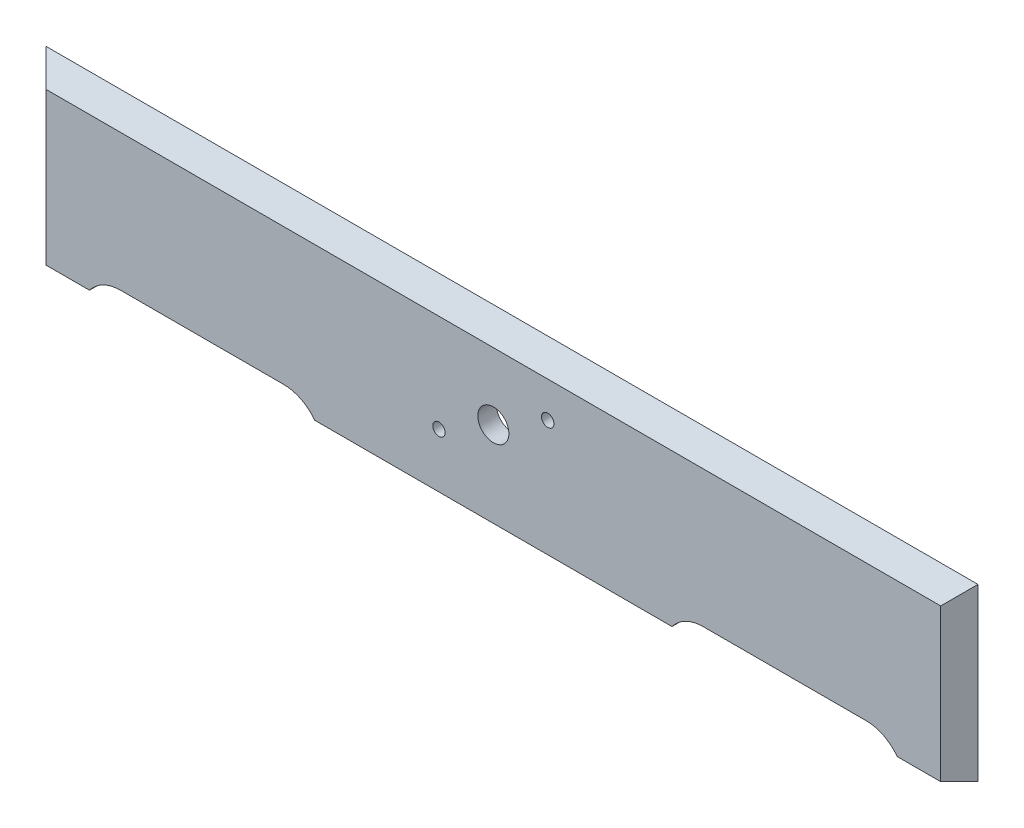
ISO-10303-21;
HEADER;
FILE_DESCRIPTION(('STEP AP214'),'2;1');
FILE_NAME('part.step','',(''),(''),'','','');
FILE_SCHEMA(('AUTOMOTIVE_DESIGN { 1 0 10303 214 1 1 1 1 }'));
ENDSEC;
DATA;
#1=APPLICATION_CONTEXT('core data for automotive mechanical design processes');
#2=APPLICATION_PROTOCOL_DEFINITION('international standard','automotive_design',2000,#1);
#3=PRODUCT_CONTEXT('',#1,'mechanical');
#4=PRODUCT('Part','Part','',(#3));
#5=PRODUCT_RELATED_PRODUCT_CATEGORY('part','',(#4));
#6=PRODUCT_DEFINITION_FORMATION('','',#4);
#7=PRODUCT_DEFINITION_CONTEXT('part definition',#1,'design');
#8=PRODUCT_DEFINITION('design','',#6,#7);
#9=PRODUCT_DEFINITION_SHAPE('','',#8);
#10=(LENGTH_UNIT() NAMED_UNIT(*) SI_UNIT(.MILLI.,.METRE.));
#11=(NAMED_UNIT(*) PLANE_ANGLE_UNIT() SI_UNIT($,.RADIAN.));
#12=(NAMED_UNIT(*) SI_UNIT($,.STERADIAN.) SOLID_ANGLE_UNIT());
#13=UNCERTAINTY_MEASURE_WITH_UNIT(LENGTH_MEASURE(1.E-05),#10,'distance_accuracy_value','');
#14=(GEOMETRIC_REPRESENTATION_CONTEXT(3) GLOBAL_UNCERTAINTY_ASSIGNED_CONTEXT((#13)) GLOBAL_UNIT_ASSIGNED_CONTEXT((#10,
#11,#12)) REPRESENTATION_CONTEXT('',''));
#15=CARTESIAN_POINT('',(0.,0.,0.));
#16=DIRECTION('',(0.,0.,1.));
#17=DIRECTION('',(1.,0.,0.));
#18=AXIS2_PLACEMENT_3D('',#15,#16,#17);
#19=CARTESIAN_POINT('',(0.,-10.,12.));
#20=DIRECTION('',(0.,1.,0.));
#21=DIRECTION('',(-1.,0.,0.));
#22=AXIS2_PLACEMENT_3D('',#19,#20,#21);
#23=PLANE('',#22);
#24=DIRECTION('',(1.,0.,0.));
#25=VECTOR('',#24,1.);
#26=CARTESIAN_POINT('',(0.,-10.,12.));
#27=LINE('',#26,#25);
#28=CARTESIAN_POINT('',(12.,-10.,12.));
#29=VERTEX_POINT('',#28);
#30=CARTESIAN_POINT('',(40.,-10.,12.));
#31=VERTEX_POINT('',#30);
#32=EDGE_CURVE('E129',#29,#31,#27,.T.);
#33=ORIENTED_EDGE('',*,*,#32,.F.);
#34=DIRECTION('',(-0.707106781186547,0.,-0.707106781186548));
#35=VECTOR('',#34,1.);
#36=CARTESIAN_POINT('',(12.,-10.,12.));
#37=LINE('',#36,#35);
#38=CARTESIAN_POINT('',(0.,-10.,0.));
#39=VERTEX_POINT('',#38);
#40=EDGE_CURVE('E11',#29,#39,#37,.T.);
#41=ORIENTED_EDGE('',*,*,#40,.T.);
#42=DIRECTION('',(1.,0.,0.));
#43=VECTOR('',#42,1.);
#44=CARTESIAN_POINT('',(0.,-10.,0.));
#45=LINE('',#44,#43);
#46=CARTESIAN_POINT('',(40.,-10.,0.));
#47=VERTEX_POINT('',#46);
#48=EDGE_CURVE('E144',#39,#47,#45,.T.);
#49=ORIENTED_EDGE('',*,*,#48,.T.);
#50=DIRECTION('',(0.,0.,-1.));
#51=VECTOR('',#50,1.);
#52=CARTESIAN_POINT('',(40.,-10.,12.));
#53=LINE('',#52,#51);
#54=EDGE_CURVE('E142',#31,#47,#53,.T.);
#55=ORIENTED_EDGE('',*,*,#54,.F.);
#56=EDGE_LOOP('',(#33,#41,#49,#55));
#57=FACE_BOUND('',#56,.T.);
#58=ADVANCED_FACE('F38',(#57),#23,.F.);
#59=CARTESIAN_POINT('',(60.,-25.,12.));
#60=DIRECTION('',(0.,0.,-1.));
#61=DIRECTION('',(-1.,0.,0.));
#62=AXIS2_PLACEMENT_3D('',#59,#60,#61);
#63=CYLINDRICAL_SURFACE('',#62,25.);
#64=CARTESIAN_POINT('',(60.,-25.,0.));
#65=DIRECTION('',(0.,0.,-1.));
#66=DIRECTION('',(-1.,0.,0.));
#67=AXIS2_PLACEMENT_3D('',#64,#65,#66);
#68=CIRCLE('',#67,25.);
#69=CARTESIAN_POINT('',(60.,0.,0.));
#70=VERTEX_POINT('',#69);
#71=EDGE_CURVE('E174',#47,#70,#68,.T.);
#72=ORIENTED_EDGE('',*,*,#71,.T.);
#73=DIRECTION('',(0.,0.,-1.));
#74=VECTOR('',#73,1.);
#75=CARTESIAN_POINT('',(60.,0.,12.));
#76=LINE('',#75,#74);
#77=CARTESIAN_POINT('',(60.,0.,12.));
#78=VERTEX_POINT('',#77);
#79=EDGE_CURVE('E147',#78,#70,#76,.T.);
#80=ORIENTED_EDGE('',*,*,#79,.F.);
#81=CARTESIAN_POINT('',(60.,-25.,12.));
#82=DIRECTION('',(0.,0.,-1.));
#83=DIRECTION('',(-1.,0.,0.));
#84=AXIS2_PLACEMENT_3D('',#81,#82,#83);
#85=CIRCLE('',#84,25.);
#86=EDGE_CURVE('E134',#31,#78,#85,.T.);
#87=ORIENTED_EDGE('',*,*,#86,.F.);
#88=ORIENTED_EDGE('',*,*,#54,.T.);
#89=EDGE_LOOP('',(#72,#80,#87,#88));
#90=FACE_BOUND('',#89,.T.);
#91=ADVANCED_FACE('F149',(#90),#63,.F.);
#92=CARTESIAN_POINT('',(60.,0.,12.));
#93=DIRECTION('',(0.,1.,0.));
#94=DIRECTION('',(0.,0.,1.));
#95=AXIS2_PLACEMENT_3D('',#92,#93,#94);
#96=PLANE('',#95);
#97=DIRECTION('',(1.,0.,0.));
#98=VECTOR('',#97,1.);
#99=CARTESIAN_POINT('',(60.,0.,0.));
#100=LINE('',#99,#98);
#101=CARTESIAN_POINT('',(165.,0.,0.));
#102=VERTEX_POINT('',#101);
#103=EDGE_CURVE('E176',#70,#102,#100,.T.);
#104=ORIENTED_EDGE('',*,*,#103,.T.);
#105=DIRECTION('',(0.,0.,-1.));
#106=VECTOR('',#105,1.);
#107=CARTESIAN_POINT('',(165.,0.,12.));
#108=LINE('',#107,#106);
#109=CARTESIAN_POINT('',(165.,0.,12.));
#110=VERTEX_POINT('',#109);
#111=EDGE_CURVE('E209',#110,#102,#108,.T.);
#112=ORIENTED_EDGE('',*,*,#111,.F.);
#113=DIRECTION('',(1.,0.,0.));
#114=VECTOR('',#113,1.);
#115=CARTESIAN_POINT('',(60.,0.,12.));
#116=LINE('',#115,#114);
#117=EDGE_CURVE('E152',#78,#110,#116,.T.);
#118=ORIENTED_EDGE('',*,*,#117,.F.);
#119=ORIENTED_EDGE('',*,*,#79,.T.);
#120=EDGE_LOOP('',(#104,#112,#118,#119));
#121=FACE_BOUND('',#120,.T.);
#122=ADVANCED_FACE('F284',(#121),#96,.F.);
#123=CARTESIAN_POINT('',(165.,-25.,12.));
#124=DIRECTION('',(0.,0.,-1.));
#125=DIRECTION('',(-1.,0.,0.));
#126=AXIS2_PLACEMENT_3D('',#123,#124,#125);
#127=CYLINDRICAL_SURFACE('',#126,25.);
#128=CARTESIAN_POINT('',(165.,-25.,0.));
#129=DIRECTION('',(0.,0.,-1.));
#130=DIRECTION('',(1.,0.,0.));
#131=AXIS2_PLACEMENT_3D('',#128,#129,#130);
#132=CIRCLE('',#131,25.);
#133=CARTESIAN_POINT('',(185.,-10.0000000000001,0.));
#134=VERTEX_POINT('',#133);
#135=EDGE_CURVE('E178',#102,#134,#132,.T.);
#136=ORIENTED_EDGE('',*,*,#135,.T.);
#137=DIRECTION('',(0.,0.,-1.));
#138=VECTOR('',#137,1.);
#139=CARTESIAN_POINT('',(185.,-10.0000000000001,12.));
#140=LINE('',#139,#138);
#141=CARTESIAN_POINT('',(185.,-10.0000000000001,12.));
#142=VERTEX_POINT('',#141);
#143=EDGE_CURVE('E206',#142,#134,#140,.T.);
#144=ORIENTED_EDGE('',*,*,#143,.F.);
#145=CARTESIAN_POINT('',(165.,-25.,12.));
#146=DIRECTION('',(0.,0.,-1.));
#147=DIRECTION('',(1.,0.,0.));
#148=AXIS2_PLACEMENT_3D('',#145,#146,#147);
#149=CIRCLE('',#148,25.);
#150=EDGE_CURVE('E154',#110,#142,#149,.T.);
#151=ORIENTED_EDGE('',*,*,#150,.F.);
#152=ORIENTED_EDGE('',*,*,#111,.T.);
#153=EDGE_LOOP('',(#136,#144,#151,#152));
#154=FACE_BOUND('',#153,.T.);
#155=ADVANCED_FACE('F281',(#154),#127,.F.);
#156=CARTESIAN_POINT('',(185.,-10.,12.));
#157=DIRECTION('',(0.,1.,0.));
#158=DIRECTION('',(0.,0.,1.));
#159=AXIS2_PLACEMENT_3D('',#156,#157,#158);
#160=PLANE('',#159);
#161=DIRECTION('',(1.,0.,0.));
#162=VECTOR('',#161,1.);
#163=CARTESIAN_POINT('',(185.,-10.,0.));
#164=LINE('',#163,#162);
#165=CARTESIAN_POINT('',(415.,-10.,0.));
#166=VERTEX_POINT('',#165);
#167=EDGE_CURVE('E180',#134,#166,#164,.T.);
#168=ORIENTED_EDGE('',*,*,#167,.T.);
#169=DIRECTION('',(0.,0.,-1.));
#170=VECTOR('',#169,1.);
#171=CARTESIAN_POINT('',(415.,-10.,12.));
#172=LINE('',#171,#170);
#173=CARTESIAN_POINT('',(415.,-10.,12.));
#174=VERTEX_POINT('',#173);
#175=EDGE_CURVE('E203',#174,#166,#172,.T.);
#176=ORIENTED_EDGE('',*,*,#175,.F.);
#177=DIRECTION('',(1.,0.,0.));
#178=VECTOR('',#177,1.);
#179=CARTESIAN_POINT('',(185.,-10.,12.));
#180=LINE('',#179,#178);
#181=EDGE_CURVE('E159',#142,#174,#180,.T.);
#182=ORIENTED_EDGE('',*,*,#181,.F.);
#183=ORIENTED_EDGE('',*,*,#143,.T.);
#184=EDGE_LOOP('',(#168,#176,#182,#183));
#185=FACE_BOUND('',#184,.T.);
#186=ADVANCED_FACE('F276',(#185),#160,.F.);
#187=CARTESIAN_POINT('',(435.,-25.,12.));
#188=DIRECTION('',(0.,0.,-1.));
#189=DIRECTION('',(-1.,0.,0.));
#190=AXIS2_PLACEMENT_3D('',#187,#188,#189);
#191=CYLINDRICAL_SURFACE('',#190,25.);
#192=CARTESIAN_POINT('',(435.,-25.,0.));
#193=DIRECTION('',(0.,0.,-1.));
#194=DIRECTION('',(-1.,0.,0.));
#195=AXIS2_PLACEMENT_3D('',#192,#193,#194);
#196=CIRCLE('',#195,25.);
#197=CARTESIAN_POINT('',(435.,0.,0.));
#198=VERTEX_POINT('',#197);
#199=EDGE_CURVE('E182',#166,#198,#196,.T.);
#200=ORIENTED_EDGE('',*,*,#199,.T.);
#201=DIRECTION('',(0.,0.,-1.));
#202=VECTOR('',#201,1.);
#203=CARTESIAN_POINT('',(435.,0.,12.));
#204=LINE('',#203,#202);
#205=CARTESIAN_POINT('',(435.,0.,12.));
#206=VERTEX_POINT('',#205);
#207=EDGE_CURVE('E200',#206,#198,#204,.T.);
#208=ORIENTED_EDGE('',*,*,#207,.F.);
#209=CARTESIAN_POINT('',(435.,-25.,12.));
#210=DIRECTION('',(0.,0.,-1.));
#211=DIRECTION('',(-1.,0.,0.));
#212=AXIS2_PLACEMENT_3D('',#209,#210,#211);
#213=CIRCLE('',#212,25.);
#214=EDGE_CURVE('E161',#174,#206,#213,.T.);
#215=ORIENTED_EDGE('',*,*,#214,.F.);
#216=ORIENTED_EDGE('',*,*,#175,.T.);
#217=EDGE_LOOP('',(#200,#208,#215,#216));
#218=FACE_BOUND('',#217,.T.);
#219=ADVANCED_FACE('F270',(#218),#191,.F.);
#220=CARTESIAN_POINT('',(435.,0.,12.));
#221=DIRECTION('',(0.,1.,0.));
#222=DIRECTION('',(0.,0.,1.));
#223=AXIS2_PLACEMENT_3D('',#220,#221,#222);
#224=PLANE('',#223);
#225=DIRECTION('',(1.,0.,0.));
#226=VECTOR('',#225,1.);
#227=CARTESIAN_POINT('',(435.,0.,0.));
#228=LINE('',#227,#226);
#229=CARTESIAN_POINT('',(540.,0.,0.));
#230=VERTEX_POINT('',#229);
#231=EDGE_CURVE('E184',#198,#230,#228,.T.);
#232=ORIENTED_EDGE('',*,*,#231,.T.);
#233=DIRECTION('',(0.,0.,-1.));
#234=VECTOR('',#233,1.);
#235=CARTESIAN_POINT('',(540.,0.,12.));
#236=LINE('',#235,#234);
#237=CARTESIAN_POINT('',(540.,0.,12.));
#238=VERTEX_POINT('',#237);
#239=EDGE_CURVE('E197',#238,#230,#236,.T.);
#240=ORIENTED_EDGE('',*,*,#239,.F.);
#241=DIRECTION('',(1.,0.,0.));
#242=VECTOR('',#241,1.);
#243=CARTESIAN_POINT('',(435.,0.,12.));
#244=LINE('',#243,#242);
#245=EDGE_CURVE('E163',#206,#238,#244,.T.);
#246=ORIENTED_EDGE('',*,*,#245,.F.);
#247=ORIENTED_EDGE('',*,*,#207,.T.);
#248=EDGE_LOOP('',(#232,#240,#246,#247));
#249=FACE_BOUND('',#248,.T.);
#250=ADVANCED_FACE('F266',(#249),#224,.F.);
#251=CARTESIAN_POINT('',(540.,-25.,12.));
#252=DIRECTION('',(0.,0.,-1.));
#253=DIRECTION('',(-1.,0.,0.));
#254=AXIS2_PLACEMENT_3D('',#251,#252,#253);
#255=CYLINDRICAL_SURFACE('',#254,25.);
#256=CARTESIAN_POINT('',(540.,-25.,0.));
#257=DIRECTION('',(0.,0.,-1.));
#258=DIRECTION('',(1.,0.,0.));
#259=AXIS2_PLACEMENT_3D('',#256,#257,#258);
#260=CIRCLE('',#259,25.);
#261=CARTESIAN_POINT('',(560.,-10.,0.));
#262=VERTEX_POINT('',#261);
#263=EDGE_CURVE('E186',#230,#262,#260,.T.);
#264=ORIENTED_EDGE('',*,*,#263,.T.);
#265=DIRECTION('',(0.,0.,-1.));
#266=VECTOR('',#265,1.);
#267=CARTESIAN_POINT('',(560.,-10.,12.));
#268=LINE('',#267,#266);
#269=CARTESIAN_POINT('',(560.,-10.,12.));
#270=VERTEX_POINT('',#269);
#271=EDGE_CURVE('E169',#270,#262,#268,.T.);
#272=ORIENTED_EDGE('',*,*,#271,.F.);
#273=CARTESIAN_POINT('',(540.,-25.,12.));
#274=DIRECTION('',(0.,0.,-1.));
#275=DIRECTION('',(1.,0.,0.));
#276=AXIS2_PLACEMENT_3D('',#273,#274,#275);
#277=CIRCLE('',#276,25.);
#278=EDGE_CURVE('E165',#238,#270,#277,.T.);
#279=ORIENTED_EDGE('',*,*,#278,.F.);
#280=ORIENTED_EDGE('',*,*,#239,.T.);
#281=EDGE_LOOP('',(#264,#272,#279,#280));
#282=FACE_BOUND('',#281,.T.);
#283=ADVANCED_FACE('F261',(#282),#255,.F.);
#284=CARTESIAN_POINT('',(600.,-10.,12.));
#285=DIRECTION('',(0.,1.,0.));
#286=DIRECTION('',(-1.,0.,0.));
#287=AXIS2_PLACEMENT_3D('',#284,#285,#286);
#288=PLANE('',#287);
#289=DIRECTION('',(1.,0.,0.));
#290=VECTOR('',#289,1.);
#291=CARTESIAN_POINT('',(600.,-10.,0.));
#292=LINE('',#291,#290);
#293=CARTESIAN_POINT('',(600.,-10.,0.));
#294=VERTEX_POINT('',#293);
#295=EDGE_CURVE('E188',#262,#294,#292,.T.);
#296=ORIENTED_EDGE('',*,*,#295,.T.);
#297=DIRECTION('',(-0.707106781186548,0.,0.707106781186548));
#298=VECTOR('',#297,1.);
#299=CARTESIAN_POINT('',(588.,-10.,12.));
#300=LINE('',#299,#298);
#301=CARTESIAN_POINT('',(588.,-10.,12.));
#302=VERTEX_POINT('',#301);
#303=EDGE_CURVE('E48',#294,#302,#300,.T.);
#304=ORIENTED_EDGE('',*,*,#303,.T.);
#305=DIRECTION('',(1.,0.,0.));
#306=VECTOR('',#305,1.);
#307=CARTESIAN_POINT('',(600.,-10.,12.));
#308=LINE('',#307,#306);
#309=EDGE_CURVE('E167',#270,#302,#308,.T.);
#310=ORIENTED_EDGE('',*,*,#309,.F.);
#311=ORIENTED_EDGE('',*,*,#271,.T.);
#312=EDGE_LOOP('',(#296,#304,#310,#311));
#313=FACE_BOUND('',#312,.T.);
#314=ADVANCED_FACE('F254',(#313),#288,.F.);
#315=CARTESIAN_POINT('',(540.,-25.,12.));
#316=DIRECTION('',(0.,0.,1.));
#317=DIRECTION('',(1.,0.,0.));
#318=AXIS2_PLACEMENT_3D('',#315,#316,#317);
#319=PLANE('',#318);
#320=CARTESIAN_POINT('',(335.,65.,12.));
#321=DIRECTION('',(0.,0.,-1.));
#322=DIRECTION('',(-1.,0.,0.));
#323=AXIS2_PLACEMENT_3D('',#320,#321,#322);
#324=CIRCLE('',#323,3.99999999999999);
#325=CARTESIAN_POINT('',(331.,65.,12.));
#326=VERTEX_POINT('',#325);
#327=EDGE_CURVE('E217',#326,#326,#324,.T.);
#328=ORIENTED_EDGE('',*,*,#327,.T.);
#329=EDGE_LOOP('',(#328));
#330=FACE_BOUND('',#329,.T.);
#331=CARTESIAN_POINT('',(300.,45.,12.));
#332=DIRECTION('',(0.,0.,-1.));
#333=DIRECTION('',(-1.,0.,0.));
#334=AXIS2_PLACEMENT_3D('',#331,#332,#333);
#335=CIRCLE('',#334,9.99999999999998);
#336=CARTESIAN_POINT('',(290.,45.,12.));
#337=VERTEX_POINT('',#336);
#338=EDGE_CURVE('E225',#337,#337,#335,.T.);
#339=ORIENTED_EDGE('',*,*,#338,.T.);
#340=EDGE_LOOP('',(#339));
#341=FACE_BOUND('',#340,.T.);
#342=CARTESIAN_POINT('',(265.,25.,12.));
#343=DIRECTION('',(0.,0.,-1.));
#344=DIRECTION('',(-1.,0.,0.));
#345=AXIS2_PLACEMENT_3D('',#342,#343,#344);
#346=CIRCLE('',#345,3.99999999999999);
#347=CARTESIAN_POINT('',(261.,25.,12.));
#348=VERTEX_POINT('',#347);
#349=EDGE_CURVE('E233',#348,#348,#346,.T.);
#350=ORIENTED_EDGE('',*,*,#349,.T.);
#351=EDGE_LOOP('',(#350));
#352=FACE_BOUND('',#351,.T.);
#353=ORIENTED_EDGE('',*,*,#309,.T.);
#354=DIRECTION('',(0.,1.,0.));
#355=VECTOR('',#354,1.);
#356=CARTESIAN_POINT('',(588.,100.,12.));
#357=LINE('',#356,#355);
#358=CARTESIAN_POINT('',(588.,88.,12.));
#359=VERTEX_POINT('',#358);
#360=EDGE_CURVE('E215',#302,#359,#357,.T.);
#361=ORIENTED_EDGE('',*,*,#360,.T.);
#362=DIRECTION('',(-1.,0.,0.));
#363=VECTOR('',#362,1.);
#364=CARTESIAN_POINT('',(0.,88.,12.));
#365=LINE('',#364,#363);
#366=CARTESIAN_POINT('',(12.,88.,12.));
#367=VERTEX_POINT('',#366);
#368=EDGE_CURVE('E56',#359,#367,#365,.T.);
#369=ORIENTED_EDGE('',*,*,#368,.T.);
#370=DIRECTION('',(0.,-1.,0.));
#371=VECTOR('',#370,1.);
#372=CARTESIAN_POINT('',(12.,-10.,12.));
#373=LINE('',#372,#371);
#374=EDGE_CURVE('E136',#367,#29,#373,.T.);
#375=ORIENTED_EDGE('',*,*,#374,.T.);
#376=ORIENTED_EDGE('',*,*,#32,.T.);
#377=ORIENTED_EDGE('',*,*,#86,.T.);
#378=ORIENTED_EDGE('',*,*,#117,.T.);
#379=ORIENTED_EDGE('',*,*,#150,.T.);
#380=ORIENTED_EDGE('',*,*,#181,.T.);
#381=ORIENTED_EDGE('',*,*,#214,.T.);
#382=ORIENTED_EDGE('',*,*,#245,.T.);
#383=ORIENTED_EDGE('',*,*,#278,.T.);
#384=EDGE_LOOP('',(#353,#361,#369,#375,#376,#377,#378,#379,#380,#381,#382,#383));
#385=FACE_BOUND('',#384,.T.);
#386=ADVANCED_FACE('F132',(#330,#341,#352,#385),#319,.T.);
#387=CARTESIAN_POINT('',(540.,-25.,0.));
#388=DIRECTION('',(0.,0.,1.));
#389=DIRECTION('',(1.,0.,0.));
#390=AXIS2_PLACEMENT_3D('',#387,#388,#389);
#391=PLANE('',#390);
#392=CARTESIAN_POINT('',(335.,65.,0.));
#393=DIRECTION('',(0.,0.,-1.));
#394=DIRECTION('',(-1.,0.,0.));
#395=AXIS2_PLACEMENT_3D('',#392,#393,#394);
#396=CIRCLE('',#395,3.99999999999999);
#397=CARTESIAN_POINT('',(331.,65.,0.));
#398=VERTEX_POINT('',#397);
#399=EDGE_CURVE('E220',#398,#398,#396,.T.);
#400=ORIENTED_EDGE('',*,*,#399,.F.);
#401=EDGE_LOOP('',(#400));
#402=FACE_BOUND('',#401,.T.);
#403=CARTESIAN_POINT('',(300.,45.,0.));
#404=DIRECTION('',(0.,0.,-1.));
#405=DIRECTION('',(-1.,0.,0.));
#406=AXIS2_PLACEMENT_3D('',#403,#404,#405);
#407=CIRCLE('',#406,9.99999999999998);
#408=CARTESIAN_POINT('',(290.,45.,0.));
#409=VERTEX_POINT('',#408);
#410=EDGE_CURVE('E230',#409,#409,#407,.T.);
#411=ORIENTED_EDGE('',*,*,#410,.F.);
#412=EDGE_LOOP('',(#411));
#413=FACE_BOUND('',#412,.T.);
#414=CARTESIAN_POINT('',(265.,25.,0.));
#415=DIRECTION('',(0.,0.,-1.));
#416=DIRECTION('',(-1.,0.,0.));
#417=AXIS2_PLACEMENT_3D('',#414,#415,#416);
#418=CIRCLE('',#417,3.99999999999999);
#419=CARTESIAN_POINT('',(261.,25.,0.));
#420=VERTEX_POINT('',#419);
#421=EDGE_CURVE('E235',#420,#420,#418,.T.);
#422=ORIENTED_EDGE('',*,*,#421,.F.);
#423=EDGE_LOOP('',(#422));
#424=FACE_BOUND('',#423,.T.);
#425=DIRECTION('',(0.,-1.,0.));
#426=VECTOR('',#425,1.);
#427=CARTESIAN_POINT('',(0.,0.,0.));
#428=LINE('',#427,#426);
#429=CARTESIAN_POINT('',(0.,100.,0.));
#430=VERTEX_POINT('',#429);
#431=EDGE_CURVE('E170',#430,#39,#428,.T.);
#432=ORIENTED_EDGE('',*,*,#431,.F.);
#433=DIRECTION('',(-1.,0.,0.));
#434=VECTOR('',#433,1.);
#435=CARTESIAN_POINT('',(0.,100.,0.));
#436=LINE('',#435,#434);
#437=CARTESIAN_POINT('',(600.,100.,0.));
#438=VERTEX_POINT('',#437);
#439=EDGE_CURVE('E139',#438,#430,#436,.T.);
#440=ORIENTED_EDGE('',*,*,#439,.F.);
#441=DIRECTION('',(0.,1.,0.));
#442=VECTOR('',#441,1.);
#443=CARTESIAN_POINT('',(600.,0.,0.));
#444=LINE('',#443,#442);
#445=EDGE_CURVE('E191',#294,#438,#444,.T.);
#446=ORIENTED_EDGE('',*,*,#445,.F.);
#447=ORIENTED_EDGE('',*,*,#295,.F.);
#448=ORIENTED_EDGE('',*,*,#263,.F.);
#449=ORIENTED_EDGE('',*,*,#231,.F.);
#450=ORIENTED_EDGE('',*,*,#199,.F.);
#451=ORIENTED_EDGE('',*,*,#167,.F.);
#452=ORIENTED_EDGE('',*,*,#135,.F.);
#453=ORIENTED_EDGE('',*,*,#103,.F.);
#454=ORIENTED_EDGE('',*,*,#71,.F.);
#455=ORIENTED_EDGE('',*,*,#48,.F.);
#456=EDGE_LOOP('',(#432,#440,#446,#447,#448,#449,#450,#451,#452,#453,#454,#455));
#457=FACE_BOUND('',#456,.T.);
#458=ADVANCED_FACE('F241',(#402,#413,#424,#457),#391,.F.);
#459=CARTESIAN_POINT('',(12.,-25.0000000000001,12.));
#460=DIRECTION('',(-0.707106781186548,0.,0.707106781186547));
#461=DIRECTION('',(0.,1.,0.));
#462=AXIS2_PLACEMENT_3D('',#459,#460,#461);
#463=PLANE('',#462);
#464=ORIENTED_EDGE('',*,*,#40,.F.);
#465=ORIENTED_EDGE('',*,*,#374,.F.);
#466=DIRECTION('',(0.577350269189626,-0.577350269189626,0.577350269189626));
#467=VECTOR('',#466,1.);
#468=CARTESIAN_POINT('',(188.,-88.,188.));
#469=LINE('',#468,#467);
#470=EDGE_CURVE('E43',#430,#367,#469,.T.);
#471=ORIENTED_EDGE('',*,*,#470,.F.);
#472=ORIENTED_EDGE('',*,*,#431,.T.);
#473=EDGE_LOOP('',(#464,#465,#471,#472));
#474=FACE_BOUND('',#473,.T.);
#475=ADVANCED_FACE('F41',(#474),#463,.T.);
#476=CARTESIAN_POINT('',(540.,88.,12.));
#477=DIRECTION('',(0.,0.707106781186547,0.707106781186547));
#478=DIRECTION('',(1.,0.,0.));
#479=AXIS2_PLACEMENT_3D('',#476,#477,#478);
#480=PLANE('',#479);
#481=ORIENTED_EDGE('',*,*,#470,.T.);
#482=ORIENTED_EDGE('',*,*,#368,.F.);
#483=DIRECTION('',(0.577350269189626,0.577350269189626,-0.577350269189626));
#484=VECTOR('',#483,1.);
#485=CARTESIAN_POINT('',(572.,72.,28.));
#486=LINE('',#485,#484);
#487=EDGE_CURVE('E64',#438,#359,#486,.F.);
#488=ORIENTED_EDGE('',*,*,#487,.F.);
#489=ORIENTED_EDGE('',*,*,#439,.T.);
#490=EDGE_LOOP('',(#481,#482,#488,#489));
#491=FACE_BOUND('',#490,.T.);
#492=ADVANCED_FACE('F249',(#491),#480,.T.);
#493=CARTESIAN_POINT('',(588.,-25.,12.));
#494=DIRECTION('',(0.707106781186547,0.,0.707106781186547));
#495=DIRECTION('',(0.,-1.,0.));
#496=AXIS2_PLACEMENT_3D('',#493,#494,#495);
#497=PLANE('',#496);
#498=ORIENTED_EDGE('',*,*,#303,.F.);
#499=ORIENTED_EDGE('',*,*,#445,.T.);
#500=ORIENTED_EDGE('',*,*,#487,.T.);
#501=ORIENTED_EDGE('',*,*,#360,.F.);
#502=EDGE_LOOP('',(#498,#499,#500,#501));
#503=FACE_BOUND('',#502,.T.);
#504=ADVANCED_FACE('F252',(#503),#497,.T.);
#505=CARTESIAN_POINT('',(265.,25.,12.));
#506=DIRECTION('',(0.,0.,-1.));
#507=DIRECTION('',(-1.,0.,0.));
#508=AXIS2_PLACEMENT_3D('',#505,#506,#507);
#509=CYLINDRICAL_SURFACE('',#508,3.99999999999999);
#510=ORIENTED_EDGE('',*,*,#349,.F.);
#511=EDGE_LOOP('',(#510));
#512=FACE_BOUND('',#511,.T.);
#513=ORIENTED_EDGE('',*,*,#421,.T.);
#514=EDGE_LOOP('',(#513));
#515=FACE_BOUND('',#514,.T.);
#516=ADVANCED_FACE('F239',(#512,#515),#509,.F.);
#517=CARTESIAN_POINT('',(300.,45.,12.));
#518=DIRECTION('',(0.,0.,-1.));
#519=DIRECTION('',(-1.,0.,0.));
#520=AXIS2_PLACEMENT_3D('',#517,#518,#519);
#521=CYLINDRICAL_SURFACE('',#520,9.99999999999998);
#522=ORIENTED_EDGE('',*,*,#338,.F.);
#523=EDGE_LOOP('',(#522));
#524=FACE_BOUND('',#523,.T.);
#525=ORIENTED_EDGE('',*,*,#410,.T.);
#526=EDGE_LOOP('',(#525));
#527=FACE_BOUND('',#526,.T.);
#528=ADVANCED_FACE('F404',(#524,#527),#521,.F.);
#529=CARTESIAN_POINT('',(335.,65.,12.));
#530=DIRECTION('',(0.,0.,-1.));
#531=DIRECTION('',(-1.,0.,0.));
#532=AXIS2_PLACEMENT_3D('',#529,#530,#531);
#533=CYLINDRICAL_SURFACE('',#532,3.99999999999999);
#534=ORIENTED_EDGE('',*,*,#327,.F.);
#535=EDGE_LOOP('',(#534));
#536=FACE_BOUND('',#535,.T.);
#537=ORIENTED_EDGE('',*,*,#399,.T.);
#538=EDGE_LOOP('',(#537));
#539=FACE_BOUND('',#538,.T.);
#540=ADVANCED_FACE('F413',(#536,#539),#533,.F.);
#541=CLOSED_SHELL('',(#58,#91,#122,#155,#186,#219,#250,#283,#314,#386,#458,#475,#492,#504,#516,
#528,#540));
#542=MANIFOLD_SOLID_BREP('B2',#541);
#543=ADVANCED_BREP_SHAPE_REPRESENTATION('',(#18,#542),#14);
#544=SHAPE_DEFINITION_REPRESENTATION(#9,#543);
ENDSEC;
END-ISO-10303-21;
